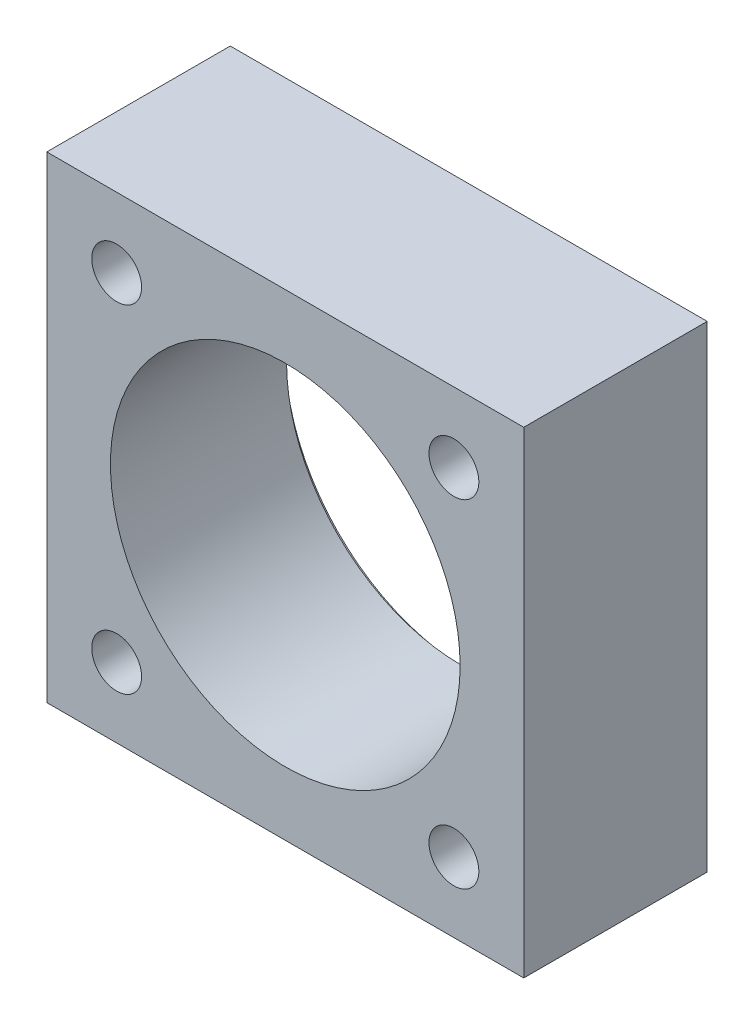
ISO-10303-21;
HEADER;
FILE_DESCRIPTION(('STEP AP214'),'2;1');
FILE_NAME('part.step','',(''),(''),'','','');
FILE_SCHEMA(('AUTOMOTIVE_DESIGN { 1 0 10303 214 1 1 1 1 }'));
ENDSEC;
DATA;
#1=APPLICATION_CONTEXT('core data for automotive mechanical design processes');
#2=APPLICATION_PROTOCOL_DEFINITION('international standard','automotive_design',2000,#1);
#3=PRODUCT_CONTEXT('',#1,'mechanical');
#4=PRODUCT('Part','Part','',(#3));
#5=PRODUCT_RELATED_PRODUCT_CATEGORY('part','',(#4));
#6=PRODUCT_DEFINITION_FORMATION('','',#4);
#7=PRODUCT_DEFINITION_CONTEXT('part definition',#1,'design');
#8=PRODUCT_DEFINITION('design','',#6,#7);
#9=PRODUCT_DEFINITION_SHAPE('','',#8);
#10=(LENGTH_UNIT() NAMED_UNIT(*) SI_UNIT(.MILLI.,.METRE.));
#11=(NAMED_UNIT(*) PLANE_ANGLE_UNIT() SI_UNIT($,.RADIAN.));
#12=(NAMED_UNIT(*) SI_UNIT($,.STERADIAN.) SOLID_ANGLE_UNIT());
#13=UNCERTAINTY_MEASURE_WITH_UNIT(LENGTH_MEASURE(1.E-05),#10,'distance_accuracy_value','');
#14=(GEOMETRIC_REPRESENTATION_CONTEXT(3) GLOBAL_UNCERTAINTY_ASSIGNED_CONTEXT((#13)) GLOBAL_UNIT_ASSIGNED_CONTEXT((#10,
#11,#12)) REPRESENTATION_CONTEXT('',''));
#15=CARTESIAN_POINT('',(0.,0.,0.));
#16=DIRECTION('',(0.,0.,1.));
#17=DIRECTION('',(1.,0.,0.));
#18=AXIS2_PLACEMENT_3D('',#15,#16,#17);
#19=CARTESIAN_POINT('',(0.,0.,0.));
#20=DIRECTION('',(0.,0.,1.));
#21=DIRECTION('',(1.,0.,0.));
#22=AXIS2_PLACEMENT_3D('',#19,#20,#21);
#23=CYLINDRICAL_SURFACE('',#22,12.10437);
#24=CARTESIAN_POINT('',(0.,0.,12.7));
#25=DIRECTION('',(0.,0.,1.));
#26=DIRECTION('',(1.,0.,0.));
#27=AXIS2_PLACEMENT_3D('',#24,#25,#26);
#28=CIRCLE('',#27,12.10437);
#29=CARTESIAN_POINT('',(12.10437,0.,12.7));
#30=VERTEX_POINT('',#29);
#31=EDGE_CURVE('E105',#30,#30,#28,.T.);
#32=ORIENTED_EDGE('',*,*,#31,.T.);
#33=EDGE_LOOP('',(#32));
#34=FACE_BOUND('',#33,.T.);
#35=CARTESIAN_POINT('',(0.,0.,0.508));
#36=DIRECTION('',(0.,0.,-1.));
#37=DIRECTION('',(-1.,0.,0.));
#38=AXIS2_PLACEMENT_3D('',#35,#36,#37);
#39=CIRCLE('',#38,12.10437);
#40=CARTESIAN_POINT('',(-12.10437,0.,0.508));
#41=VERTEX_POINT('',#40);
#42=EDGE_CURVE('E40',#41,#41,#39,.F.);
#43=ORIENTED_EDGE('',*,*,#42,.F.);
#44=EDGE_LOOP('',(#43));
#45=FACE_BOUND('',#44,.T.);
#46=ADVANCED_FACE('F36',(#34,#45),#23,.F.);
#47=CARTESIAN_POINT('',(16.51,16.51,12.7));
#48=DIRECTION('',(-1.,0.,0.));
#49=DIRECTION('',(0.,-1.,0.));
#50=AXIS2_PLACEMENT_3D('',#47,#48,#49);
#51=PLANE('',#50);
#52=DIRECTION('',(0.,1.,0.));
#53=VECTOR('',#52,1.);
#54=CARTESIAN_POINT('',(16.51,16.51,0.));
#55=LINE('',#54,#53);
#56=CARTESIAN_POINT('',(16.51,-16.51,0.));
#57=VERTEX_POINT('',#56);
#58=CARTESIAN_POINT('',(16.51,16.51,0.));
#59=VERTEX_POINT('',#58);
#60=EDGE_CURVE('E102',#57,#59,#55,.T.);
#61=ORIENTED_EDGE('',*,*,#60,.T.);
#62=DIRECTION('',(0.,0.,-1.));
#63=VECTOR('',#62,1.);
#64=CARTESIAN_POINT('',(16.51,16.51,12.7));
#65=LINE('',#64,#63);
#66=CARTESIAN_POINT('',(16.51,16.51,12.7));
#67=VERTEX_POINT('',#66);
#68=EDGE_CURVE('E11',#67,#59,#65,.T.);
#69=ORIENTED_EDGE('',*,*,#68,.F.);
#70=DIRECTION('',(0.,1.,0.));
#71=VECTOR('',#70,1.);
#72=CARTESIAN_POINT('',(16.51,16.51,12.7));
#73=LINE('',#72,#71);
#74=CARTESIAN_POINT('',(16.51,-16.51,12.7));
#75=VERTEX_POINT('',#74);
#76=EDGE_CURVE('E89',#75,#67,#73,.T.);
#77=ORIENTED_EDGE('',*,*,#76,.F.);
#78=DIRECTION('',(0.,0.,-1.));
#79=VECTOR('',#78,1.);
#80=CARTESIAN_POINT('',(16.51,-16.51,12.7));
#81=LINE('',#80,#79);
#82=EDGE_CURVE('E98',#75,#57,#81,.T.);
#83=ORIENTED_EDGE('',*,*,#82,.T.);
#84=EDGE_LOOP('',(#61,#69,#77,#83));
#85=FACE_BOUND('',#84,.T.);
#86=ADVANCED_FACE('F38',(#85),#51,.F.);
#87=CARTESIAN_POINT('',(-16.51,16.51,12.7));
#88=DIRECTION('',(0.,-1.,0.));
#89=DIRECTION('',(0.,0.,-1.));
#90=AXIS2_PLACEMENT_3D('',#87,#88,#89);
#91=PLANE('',#90);
#92=DIRECTION('',(-1.,0.,0.));
#93=VECTOR('',#92,1.);
#94=CARTESIAN_POINT('',(-16.51,16.51,0.));
#95=LINE('',#94,#93);
#96=CARTESIAN_POINT('',(-16.51,16.51,0.));
#97=VERTEX_POINT('',#96);
#98=EDGE_CURVE('E93',#59,#97,#95,.T.);
#99=ORIENTED_EDGE('',*,*,#98,.T.);
#100=DIRECTION('',(0.,0.,-1.));
#101=VECTOR('',#100,1.);
#102=CARTESIAN_POINT('',(-16.51,16.51,12.7));
#103=LINE('',#102,#101);
#104=CARTESIAN_POINT('',(-16.51,16.51,12.7));
#105=VERTEX_POINT('',#104);
#106=EDGE_CURVE('E46',#105,#97,#103,.T.);
#107=ORIENTED_EDGE('',*,*,#106,.F.);
#108=DIRECTION('',(-1.,0.,0.));
#109=VECTOR('',#108,1.);
#110=CARTESIAN_POINT('',(-16.51,16.51,12.7));
#111=LINE('',#110,#109);
#112=EDGE_CURVE('E84',#67,#105,#111,.T.);
#113=ORIENTED_EDGE('',*,*,#112,.F.);
#114=ORIENTED_EDGE('',*,*,#68,.T.);
#115=EDGE_LOOP('',(#99,#107,#113,#114));
#116=FACE_BOUND('',#115,.T.);
#117=ADVANCED_FACE('F92',(#116),#91,.F.);
#118=CARTESIAN_POINT('',(-16.51,16.51,12.7));
#119=DIRECTION('',(1.,0.,0.));
#120=DIRECTION('',(0.,1.,0.));
#121=AXIS2_PLACEMENT_3D('',#118,#119,#120);
#122=PLANE('',#121);
#123=DIRECTION('',(0.,-1.,0.));
#124=VECTOR('',#123,1.);
#125=CARTESIAN_POINT('',(-16.51,16.51,0.));
#126=LINE('',#125,#124);
#127=CARTESIAN_POINT('',(-16.51,-16.51,0.));
#128=VERTEX_POINT('',#127);
#129=EDGE_CURVE('E71',#97,#128,#126,.T.);
#130=ORIENTED_EDGE('',*,*,#129,.T.);
#131=DIRECTION('',(0.,0.,-1.));
#132=VECTOR('',#131,1.);
#133=CARTESIAN_POINT('',(-16.51,-16.51,12.7));
#134=LINE('',#133,#132);
#135=CARTESIAN_POINT('',(-16.51,-16.51,12.7));
#136=VERTEX_POINT('',#135);
#137=EDGE_CURVE('E94',#136,#128,#134,.T.);
#138=ORIENTED_EDGE('',*,*,#137,.F.);
#139=DIRECTION('',(0.,-1.,0.));
#140=VECTOR('',#139,1.);
#141=CARTESIAN_POINT('',(-16.51,16.51,12.7));
#142=LINE('',#141,#140);
#143=EDGE_CURVE('E87',#105,#136,#142,.T.);
#144=ORIENTED_EDGE('',*,*,#143,.F.);
#145=ORIENTED_EDGE('',*,*,#106,.T.);
#146=EDGE_LOOP('',(#130,#138,#144,#145));
#147=FACE_BOUND('',#146,.T.);
#148=ADVANCED_FACE('F96',(#147),#122,.F.);
#149=CARTESIAN_POINT('',(-16.51,-16.51,12.7));
#150=DIRECTION('',(0.,1.,0.));
#151=DIRECTION('',(0.,0.,1.));
#152=AXIS2_PLACEMENT_3D('',#149,#150,#151);
#153=PLANE('',#152);
#154=DIRECTION('',(1.,0.,0.));
#155=VECTOR('',#154,1.);
#156=CARTESIAN_POINT('',(-16.51,-16.51,0.));
#157=LINE('',#156,#155);
#158=EDGE_CURVE('E77',#128,#57,#157,.T.);
#159=ORIENTED_EDGE('',*,*,#158,.T.);
#160=ORIENTED_EDGE('',*,*,#82,.F.);
#161=DIRECTION('',(1.,0.,0.));
#162=VECTOR('',#161,1.);
#163=CARTESIAN_POINT('',(-16.51,-16.51,12.7));
#164=LINE('',#163,#162);
#165=EDGE_CURVE('E54',#136,#75,#164,.T.);
#166=ORIENTED_EDGE('',*,*,#165,.F.);
#167=ORIENTED_EDGE('',*,*,#137,.T.);
#168=EDGE_LOOP('',(#159,#160,#166,#167));
#169=FACE_BOUND('',#168,.T.);
#170=ADVANCED_FACE('F110',(#169),#153,.F.);
#171=CARTESIAN_POINT('',(0.,0.,12.7));
#172=DIRECTION('',(0.,0.,1.));
#173=DIRECTION('',(1.,0.,0.));
#174=AXIS2_PLACEMENT_3D('',#171,#172,#173);
#175=PLANE('',#174);
#176=CARTESIAN_POINT('',(-11.6743329573899,11.6743329573899,12.7));
#177=DIRECTION('',(0.,0.,1.));
#178=DIRECTION('',(1.,0.,0.));
#179=AXIS2_PLACEMENT_3D('',#176,#177,#178);
#180=CIRCLE('',#179,1.72719999999999);
#181=CARTESIAN_POINT('',(-9.94713295738991,11.6743329573899,12.7));
#182=VERTEX_POINT('',#181);
#183=EDGE_CURVE('E139',#182,#182,#180,.T.);
#184=ORIENTED_EDGE('',*,*,#183,.F.);
#185=EDGE_LOOP('',(#184));
#186=FACE_BOUND('',#185,.T.);
#187=CARTESIAN_POINT('',(11.6743329573899,11.6743329573906,12.7));
#188=DIRECTION('',(0.,0.,1.));
#189=DIRECTION('',(1.,0.,0.));
#190=AXIS2_PLACEMENT_3D('',#187,#188,#189);
#191=CIRCLE('',#190,1.72719999999999);
#192=CARTESIAN_POINT('',(13.4015329573899,11.6743329573906,12.7));
#193=VERTEX_POINT('',#192);
#194=EDGE_CURVE('E133',#193,#193,#191,.T.);
#195=ORIENTED_EDGE('',*,*,#194,.F.);
#196=EDGE_LOOP('',(#195));
#197=FACE_BOUND('',#196,.T.);
#198=CARTESIAN_POINT('',(11.6743329573906,-11.6743329573892,12.7));
#199=DIRECTION('',(0.,0.,1.));
#200=DIRECTION('',(1.,0.,0.));
#201=AXIS2_PLACEMENT_3D('',#198,#199,#200);
#202=CIRCLE('',#201,1.72719999999999);
#203=CARTESIAN_POINT('',(13.4015329573905,-11.6743329573892,12.7));
#204=VERTEX_POINT('',#203);
#205=EDGE_CURVE('E127',#204,#204,#202,.T.);
#206=ORIENTED_EDGE('',*,*,#205,.F.);
#207=EDGE_LOOP('',(#206));
#208=FACE_BOUND('',#207,.T.);
#209=CARTESIAN_POINT('',(-11.6743329573892,-11.6743329573899,12.7));
#210=DIRECTION('',(0.,0.,1.));
#211=DIRECTION('',(1.,0.,0.));
#212=AXIS2_PLACEMENT_3D('',#209,#210,#211);
#213=CIRCLE('',#212,1.72719999999999);
#214=CARTESIAN_POINT('',(-9.94713295738925,-11.6743329573899,12.7));
#215=VERTEX_POINT('',#214);
#216=EDGE_CURVE('E121',#215,#215,#213,.T.);
#217=ORIENTED_EDGE('',*,*,#216,.F.);
#218=EDGE_LOOP('',(#217));
#219=FACE_BOUND('',#218,.T.);
#220=ORIENTED_EDGE('',*,*,#31,.F.);
#221=EDGE_LOOP('',(#220));
#222=FACE_BOUND('',#221,.T.);
#223=ORIENTED_EDGE('',*,*,#76,.T.);
#224=ORIENTED_EDGE('',*,*,#112,.T.);
#225=ORIENTED_EDGE('',*,*,#143,.T.);
#226=ORIENTED_EDGE('',*,*,#165,.T.);
#227=EDGE_LOOP('',(#223,#224,#225,#226));
#228=FACE_BOUND('',#227,.T.);
#229=ADVANCED_FACE('F85',(#186,#197,#208,#219,#222,#228),#175,.T.);
#230=CARTESIAN_POINT('',(0.,0.,0.));
#231=DIRECTION('',(0.,0.,1.));
#232=DIRECTION('',(1.,0.,0.));
#233=AXIS2_PLACEMENT_3D('',#230,#231,#232);
#234=PLANE('',#233);
#235=CARTESIAN_POINT('',(0.,0.,0.));
#236=DIRECTION('',(0.,0.,-1.));
#237=DIRECTION('',(-1.,0.,0.));
#238=AXIS2_PLACEMENT_3D('',#235,#236,#237);
#239=CIRCLE('',#238,12.7);
#240=CARTESIAN_POINT('',(-12.7,0.,0.));
#241=VERTEX_POINT('',#240);
#242=EDGE_CURVE('E142',#241,#241,#239,.T.);
#243=ORIENTED_EDGE('',*,*,#242,.F.);
#244=EDGE_LOOP('',(#243));
#245=FACE_BOUND('',#244,.T.);
#246=CARTESIAN_POINT('',(-11.6743329573899,11.6743329573899,0.));
#247=DIRECTION('',(0.,0.,1.));
#248=DIRECTION('',(1.,0.,0.));
#249=AXIS2_PLACEMENT_3D('',#246,#247,#248);
#250=CIRCLE('',#249,1.7272);
#251=CARTESIAN_POINT('',(-9.9471329573899,11.6743329573899,0.));
#252=VERTEX_POINT('',#251);
#253=EDGE_CURVE('E136',#252,#252,#250,.T.);
#254=ORIENTED_EDGE('',*,*,#253,.T.);
#255=EDGE_LOOP('',(#254));
#256=FACE_BOUND('',#255,.T.);
#257=CARTESIAN_POINT('',(11.6743329573899,11.6743329573906,0.));
#258=DIRECTION('',(0.,0.,1.));
#259=DIRECTION('',(1.,0.,0.));
#260=AXIS2_PLACEMENT_3D('',#257,#258,#259);
#261=CIRCLE('',#260,1.7272);
#262=CARTESIAN_POINT('',(13.4015329573899,11.6743329573906,0.));
#263=VERTEX_POINT('',#262);
#264=EDGE_CURVE('E130',#263,#263,#261,.T.);
#265=ORIENTED_EDGE('',*,*,#264,.T.);
#266=EDGE_LOOP('',(#265));
#267=FACE_BOUND('',#266,.T.);
#268=CARTESIAN_POINT('',(11.6743329573906,-11.6743329573892,0.));
#269=DIRECTION('',(0.,0.,1.));
#270=DIRECTION('',(1.,0.,0.));
#271=AXIS2_PLACEMENT_3D('',#268,#269,#270);
#272=CIRCLE('',#271,1.7272);
#273=CARTESIAN_POINT('',(13.4015329573906,-11.6743329573892,0.));
#274=VERTEX_POINT('',#273);
#275=EDGE_CURVE('E124',#274,#274,#272,.T.);
#276=ORIENTED_EDGE('',*,*,#275,.T.);
#277=EDGE_LOOP('',(#276));
#278=FACE_BOUND('',#277,.T.);
#279=CARTESIAN_POINT('',(-11.6743329573892,-11.6743329573899,0.));
#280=DIRECTION('',(0.,0.,1.));
#281=DIRECTION('',(1.,0.,0.));
#282=AXIS2_PLACEMENT_3D('',#279,#280,#281);
#283=CIRCLE('',#282,1.7272);
#284=CARTESIAN_POINT('',(-9.94713295738924,-11.6743329573899,0.));
#285=VERTEX_POINT('',#284);
#286=EDGE_CURVE('E118',#285,#285,#283,.T.);
#287=ORIENTED_EDGE('',*,*,#286,.T.);
#288=EDGE_LOOP('',(#287));
#289=FACE_BOUND('',#288,.T.);
#290=ORIENTED_EDGE('',*,*,#60,.F.);
#291=ORIENTED_EDGE('',*,*,#158,.F.);
#292=ORIENTED_EDGE('',*,*,#129,.F.);
#293=ORIENTED_EDGE('',*,*,#98,.F.);
#294=EDGE_LOOP('',(#290,#291,#292,#293));
#295=FACE_BOUND('',#294,.T.);
#296=ADVANCED_FACE('F113',(#245,#256,#267,#278,#289,#295),#234,.F.);
#297=CARTESIAN_POINT('',(-11.6743329573892,-11.6743329573899,12.7));
#298=DIRECTION('',(0.,0.,1.));
#299=DIRECTION('',(1.,0.,0.));
#300=AXIS2_PLACEMENT_3D('',#297,#298,#299);
#301=CYLINDRICAL_SURFACE('',#300,1.72719999999999);
#302=ORIENTED_EDGE('',*,*,#286,.F.);
#303=EDGE_LOOP('',(#302));
#304=FACE_BOUND('',#303,.T.);
#305=ORIENTED_EDGE('',*,*,#216,.T.);
#306=EDGE_LOOP('',(#305));
#307=FACE_BOUND('',#306,.T.);
#308=ADVANCED_FACE('F162',(#304,#307),#301,.F.);
#309=CARTESIAN_POINT('',(11.6743329573906,-11.6743329573892,12.7));
#310=DIRECTION('',(0.,0.,1.));
#311=DIRECTION('',(1.,0.,0.));
#312=AXIS2_PLACEMENT_3D('',#309,#310,#311);
#313=CYLINDRICAL_SURFACE('',#312,1.72719999999999);
#314=ORIENTED_EDGE('',*,*,#275,.F.);
#315=EDGE_LOOP('',(#314));
#316=FACE_BOUND('',#315,.T.);
#317=ORIENTED_EDGE('',*,*,#205,.T.);
#318=EDGE_LOOP('',(#317));
#319=FACE_BOUND('',#318,.T.);
#320=ADVANCED_FACE('F202',(#316,#319),#313,.F.);
#321=CARTESIAN_POINT('',(11.6743329573899,11.6743329573906,12.7));
#322=DIRECTION('',(0.,0.,1.));
#323=DIRECTION('',(1.,0.,0.));
#324=AXIS2_PLACEMENT_3D('',#321,#322,#323);
#325=CYLINDRICAL_SURFACE('',#324,1.72719999999999);
#326=ORIENTED_EDGE('',*,*,#264,.F.);
#327=EDGE_LOOP('',(#326));
#328=FACE_BOUND('',#327,.T.);
#329=ORIENTED_EDGE('',*,*,#194,.T.);
#330=EDGE_LOOP('',(#329));
#331=FACE_BOUND('',#330,.T.);
#332=ADVANCED_FACE('F208',(#328,#331),#325,.F.);
#333=CARTESIAN_POINT('',(-11.6743329573899,11.6743329573899,12.7));
#334=DIRECTION('',(0.,0.,1.));
#335=DIRECTION('',(1.,0.,0.));
#336=AXIS2_PLACEMENT_3D('',#333,#334,#335);
#337=CYLINDRICAL_SURFACE('',#336,1.72719999999999);
#338=ORIENTED_EDGE('',*,*,#253,.F.);
#339=EDGE_LOOP('',(#338));
#340=FACE_BOUND('',#339,.T.);
#341=ORIENTED_EDGE('',*,*,#183,.T.);
#342=EDGE_LOOP('',(#341));
#343=FACE_BOUND('',#342,.T.);
#344=ADVANCED_FACE('F215',(#340,#343),#337,.F.);
#345=CARTESIAN_POINT('',(0.,0.,0.508));
#346=DIRECTION('',(0.,0.,-1.));
#347=DIRECTION('',(-1.,0.,0.));
#348=AXIS2_PLACEMENT_3D('',#345,#346,#347);
#349=PLANE('',#348);
#350=CARTESIAN_POINT('',(0.,0.,0.508));
#351=DIRECTION('',(0.,0.,-1.));
#352=DIRECTION('',(-1.,0.,0.));
#353=AXIS2_PLACEMENT_3D('',#350,#351,#352);
#354=CIRCLE('',#353,12.7);
#355=CARTESIAN_POINT('',(-12.7,0.,0.508));
#356=VERTEX_POINT('',#355);
#357=EDGE_CURVE('E145',#356,#356,#354,.T.);
#358=ORIENTED_EDGE('',*,*,#357,.T.);
#359=EDGE_LOOP('',(#358));
#360=FACE_BOUND('',#359,.T.);
#361=ORIENTED_EDGE('',*,*,#42,.T.);
#362=EDGE_LOOP('',(#361));
#363=FACE_BOUND('',#362,.T.);
#364=ADVANCED_FACE('F152',(#360,#363),#349,.T.);
#365=CARTESIAN_POINT('',(0.,0.,0.508));
#366=DIRECTION('',(0.,0.,-1.));
#367=DIRECTION('',(-1.,0.,0.));
#368=AXIS2_PLACEMENT_3D('',#365,#366,#367);
#369=CYLINDRICAL_SURFACE('',#368,12.7);
#370=ORIENTED_EDGE('',*,*,#357,.F.);
#371=EDGE_LOOP('',(#370));
#372=FACE_BOUND('',#371,.T.);
#373=ORIENTED_EDGE('',*,*,#242,.T.);
#374=EDGE_LOOP('',(#373));
#375=FACE_BOUND('',#374,.T.);
#376=ADVANCED_FACE('F229',(#372,#375),#369,.F.);
#377=CLOSED_SHELL('',(#46,#86,#117,#148,#170,#229,#296,#308,#320,#332,#344,#364,#376));
#378=MANIFOLD_SOLID_BREP('B2',#377);
#379=ADVANCED_BREP_SHAPE_REPRESENTATION('',(#18,#378),#14);
#380=SHAPE_DEFINITION_REPRESENTATION(#9,#379);
ENDSEC;
END-ISO-10303-21;
